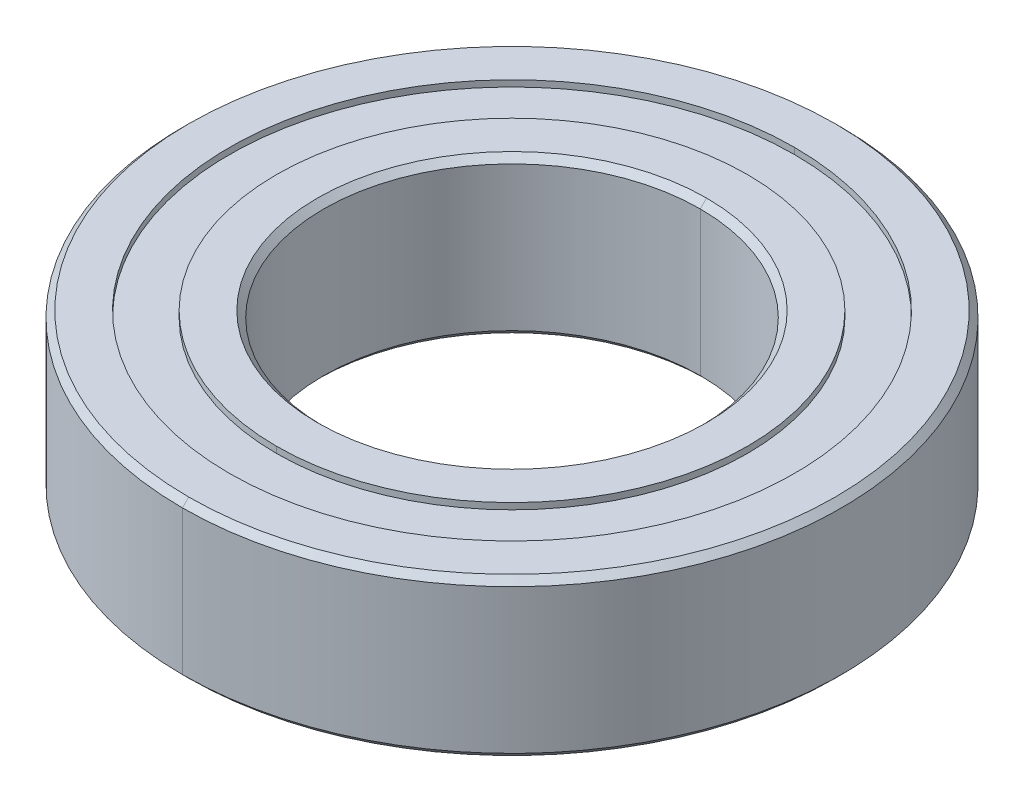
ISO-10303-21;
HEADER;
FILE_DESCRIPTION(('STEP AP214'),'2;1');
FILE_NAME('part.step','',(''),(''),'','','');
FILE_SCHEMA(('AUTOMOTIVE_DESIGN { 1 0 10303 214 1 1 1 1 }'));
ENDSEC;
DATA;
#1=APPLICATION_CONTEXT('core data for automotive mechanical design processes');
#2=APPLICATION_PROTOCOL_DEFINITION('international standard','automotive_design',2000,#1);
#3=PRODUCT_CONTEXT('',#1,'mechanical');
#4=PRODUCT('Part','Part','',(#3));
#5=PRODUCT_RELATED_PRODUCT_CATEGORY('part','',(#4));
#6=PRODUCT_DEFINITION_FORMATION('','',#4);
#7=PRODUCT_DEFINITION_CONTEXT('part definition',#1,'design');
#8=PRODUCT_DEFINITION('design','',#6,#7);
#9=PRODUCT_DEFINITION_SHAPE('','',#8);
#10=(LENGTH_UNIT() NAMED_UNIT(*) SI_UNIT(.MILLI.,.METRE.));
#11=(NAMED_UNIT(*) PLANE_ANGLE_UNIT() SI_UNIT($,.RADIAN.));
#12=(NAMED_UNIT(*) SI_UNIT($,.STERADIAN.) SOLID_ANGLE_UNIT());
#13=UNCERTAINTY_MEASURE_WITH_UNIT(LENGTH_MEASURE(1.E-05),#10,'distance_accuracy_value','');
#14=(GEOMETRIC_REPRESENTATION_CONTEXT(3) GLOBAL_UNCERTAINTY_ASSIGNED_CONTEXT((#13)) GLOBAL_UNIT_ASSIGNED_CONTEXT((#10,
#11,#12)) REPRESENTATION_CONTEXT('',''));
#15=CARTESIAN_POINT('',(0.,0.,0.));
#16=DIRECTION('',(0.,0.,1.));
#17=DIRECTION('',(1.,0.,0.));
#18=AXIS2_PLACEMENT_3D('',#15,#16,#17);
#19=CARTESIAN_POINT('',(0.,0.,0.));
#20=DIRECTION('',(0.,-1.,0.));
#21=DIRECTION('',(0.,0.,-1.));
#22=AXIS2_PLACEMENT_3D('',#19,#20,#21);
#23=CONICAL_SURFACE('',#22,6.2,0.785398163397443);
#24=DIRECTION('',(0.,-0.707106781186551,0.707106781186545));
#25=VECTOR('',#24,1.);
#26=CARTESIAN_POINT('',(0.,0.,6.2));
#27=LINE('',#26,#25);
#28=CARTESIAN_POINT('',(0.,0.199999999999996,6.));
#29=VERTEX_POINT('',#28);
#30=CARTESIAN_POINT('',(0.,0.,6.2));
#31=VERTEX_POINT('',#30);
#32=EDGE_CURVE('E283',#29,#31,#27,.T.);
#33=ORIENTED_EDGE('',*,*,#32,.F.);
#34=CARTESIAN_POINT('',(0.,0.199999999999996,0.));
#35=DIRECTION('',(0.,-1.,0.));
#36=DIRECTION('',(0.,0.,1.));
#37=AXIS2_PLACEMENT_3D('',#34,#35,#36);
#38=CIRCLE('',#37,6.);
#39=CARTESIAN_POINT('',(0.,0.199999999999996,-6.));
#40=VERTEX_POINT('',#39);
#41=EDGE_CURVE('E255',#40,#29,#38,.T.);
#42=ORIENTED_EDGE('',*,*,#41,.F.);
#43=DIRECTION('',(0.,-0.707106781186551,-0.707106781186545));
#44=VECTOR('',#43,1.);
#45=CARTESIAN_POINT('',(0.,0.,-6.2));
#46=LINE('',#45,#44);
#47=CARTESIAN_POINT('',(0.,0.,-6.2));
#48=VERTEX_POINT('',#47);
#49=EDGE_CURVE('E284',#40,#48,#46,.T.);
#50=ORIENTED_EDGE('',*,*,#49,.T.);
#51=CARTESIAN_POINT('',(0.,0.,0.));
#52=DIRECTION('',(0.,1.,0.));
#53=DIRECTION('',(0.,0.,1.));
#54=AXIS2_PLACEMENT_3D('',#51,#52,#53);
#55=CIRCLE('',#54,6.2);
#56=EDGE_CURVE('E181',#31,#48,#55,.T.);
#57=ORIENTED_EDGE('',*,*,#56,.F.);
#58=EDGE_LOOP('',(#33,#42,#50,#57));
#59=FACE_BOUND('',#58,.T.);
#60=ADVANCED_FACE('F18',(#59),#23,.F.);
#61=CARTESIAN_POINT('',(0.,4.8,0.));
#62=DIRECTION('',(0.,1.,0.));
#63=DIRECTION('',(0.,0.,1.));
#64=AXIS2_PLACEMENT_3D('',#61,#62,#63);
#65=CONICAL_SURFACE('',#64,6.,0.785398163397452);
#66=DIRECTION('',(0.,0.707106781186545,-0.707106781186551));
#67=VECTOR('',#66,1.);
#68=CARTESIAN_POINT('',(0.,4.8,-6.));
#69=LINE('',#68,#67);
#70=CARTESIAN_POINT('',(0.,4.8,-6.));
#71=VERTEX_POINT('',#70);
#72=CARTESIAN_POINT('',(0.,5.,-6.2));
#73=VERTEX_POINT('',#72);
#74=EDGE_CURVE('E295',#71,#73,#69,.T.);
#75=ORIENTED_EDGE('',*,*,#74,.F.);
#76=CARTESIAN_POINT('',(0.,4.8,0.));
#77=DIRECTION('',(0.,1.,0.));
#78=DIRECTION('',(0.,0.,1.));
#79=AXIS2_PLACEMENT_3D('',#76,#77,#78);
#80=CIRCLE('',#79,6.);
#81=CARTESIAN_POINT('',(0.,4.8,6.));
#82=VERTEX_POINT('',#81);
#83=EDGE_CURVE('E253',#82,#71,#80,.T.);
#84=ORIENTED_EDGE('',*,*,#83,.F.);
#85=DIRECTION('',(0.,0.707106781186545,0.707106781186551));
#86=VECTOR('',#85,1.);
#87=CARTESIAN_POINT('',(0.,4.8,6.));
#88=LINE('',#87,#86);
#89=CARTESIAN_POINT('',(0.,5.,6.2));
#90=VERTEX_POINT('',#89);
#91=EDGE_CURVE('E298',#82,#90,#88,.T.);
#92=ORIENTED_EDGE('',*,*,#91,.T.);
#93=CARTESIAN_POINT('',(0.,5.,0.));
#94=DIRECTION('',(0.,-1.,0.));
#95=DIRECTION('',(0.,0.,1.));
#96=AXIS2_PLACEMENT_3D('',#93,#94,#95);
#97=CIRCLE('',#96,6.2);
#98=EDGE_CURVE('E185',#73,#90,#97,.T.);
#99=ORIENTED_EDGE('',*,*,#98,.F.);
#100=EDGE_LOOP('',(#75,#84,#92,#99));
#101=FACE_BOUND('',#100,.T.);
#102=ADVANCED_FACE('F418',(#101),#65,.F.);
#103=CARTESIAN_POINT('',(0.,0.199999999999997,0.));
#104=DIRECTION('',(0.,1.,0.));
#105=DIRECTION('',(0.,0.,1.));
#106=AXIS2_PLACEMENT_3D('',#103,#104,#105);
#107=CONICAL_SURFACE('',#106,10.5,0.785398163397452);
#108=DIRECTION('',(0.,0.707106781186545,-0.707106781186551));
#109=VECTOR('',#108,1.);
#110=CARTESIAN_POINT('',(0.,0.199999999999997,-10.5));
#111=LINE('',#110,#109);
#112=CARTESIAN_POINT('',(0.,0.,-10.3));
#113=VERTEX_POINT('',#112);
#114=CARTESIAN_POINT('',(0.,0.199999999999997,-10.5));
#115=VERTEX_POINT('',#114);
#116=EDGE_CURVE('E285',#113,#115,#111,.T.);
#117=ORIENTED_EDGE('',*,*,#116,.F.);
#118=CARTESIAN_POINT('',(0.,0.,0.));
#119=DIRECTION('',(0.,-1.,0.));
#120=DIRECTION('',(0.,0.,1.));
#121=AXIS2_PLACEMENT_3D('',#118,#119,#120);
#122=CIRCLE('',#121,10.3);
#123=CARTESIAN_POINT('',(0.,0.,10.3));
#124=VERTEX_POINT('',#123);
#125=EDGE_CURVE('E237',#124,#113,#122,.T.);
#126=ORIENTED_EDGE('',*,*,#125,.F.);
#127=DIRECTION('',(0.,0.707106781186545,0.707106781186551));
#128=VECTOR('',#127,1.);
#129=CARTESIAN_POINT('',(0.,0.199999999999997,10.5));
#130=LINE('',#129,#128);
#131=CARTESIAN_POINT('',(0.,0.199999999999997,10.5));
#132=VERTEX_POINT('',#131);
#133=EDGE_CURVE('E310',#124,#132,#130,.T.);
#134=ORIENTED_EDGE('',*,*,#133,.T.);
#135=CARTESIAN_POINT('',(0.,0.199999999999997,0.));
#136=DIRECTION('',(0.,1.,0.));
#137=DIRECTION('',(0.,0.,1.));
#138=AXIS2_PLACEMENT_3D('',#135,#136,#137);
#139=CIRCLE('',#138,10.5);
#140=EDGE_CURVE('E249',#115,#132,#139,.T.);
#141=ORIENTED_EDGE('',*,*,#140,.F.);
#142=EDGE_LOOP('',(#117,#126,#134,#141));
#143=FACE_BOUND('',#142,.T.);
#144=ADVANCED_FACE('F385',(#143),#107,.T.);
#145=CARTESIAN_POINT('',(0.,5.,0.));
#146=DIRECTION('',(0.,-1.,0.));
#147=DIRECTION('',(0.,0.,-1.));
#148=AXIS2_PLACEMENT_3D('',#145,#146,#147);
#149=CONICAL_SURFACE('',#148,10.3,0.785398163397448);
#150=DIRECTION('',(0.,-0.707106781186548,0.707106781186548));
#151=VECTOR('',#150,1.);
#152=CARTESIAN_POINT('',(0.,5.,10.3));
#153=LINE('',#152,#151);
#154=CARTESIAN_POINT('',(0.,5.,10.3));
#155=VERTEX_POINT('',#154);
#156=CARTESIAN_POINT('',(0.,4.8,10.5));
#157=VERTEX_POINT('',#156);
#158=EDGE_CURVE('E321',#155,#157,#153,.T.);
#159=ORIENTED_EDGE('',*,*,#158,.F.);
#160=CARTESIAN_POINT('',(0.,5.,0.));
#161=DIRECTION('',(0.,1.,0.));
#162=DIRECTION('',(0.,0.,1.));
#163=AXIS2_PLACEMENT_3D('',#160,#161,#162);
#164=CIRCLE('',#163,10.3);
#165=CARTESIAN_POINT('',(0.,5.,-10.3));
#166=VERTEX_POINT('',#165);
#167=EDGE_CURVE('E231',#166,#155,#164,.T.);
#168=ORIENTED_EDGE('',*,*,#167,.F.);
#169=DIRECTION('',(0.,-0.707106781186548,-0.707106781186548));
#170=VECTOR('',#169,1.);
#171=CARTESIAN_POINT('',(0.,5.,-10.3));
#172=LINE('',#171,#170);
#173=CARTESIAN_POINT('',(0.,4.8,-10.5));
#174=VERTEX_POINT('',#173);
#175=EDGE_CURVE('E329',#166,#174,#172,.T.);
#176=ORIENTED_EDGE('',*,*,#175,.T.);
#177=CARTESIAN_POINT('',(0.,4.8,0.));
#178=DIRECTION('',(0.,-1.,0.));
#179=DIRECTION('',(0.,0.,1.));
#180=AXIS2_PLACEMENT_3D('',#177,#178,#179);
#181=CIRCLE('',#180,10.5);
#182=EDGE_CURVE('E244',#157,#174,#181,.T.);
#183=ORIENTED_EDGE('',*,*,#182,.F.);
#184=EDGE_LOOP('',(#159,#168,#176,#183));
#185=FACE_BOUND('',#184,.T.);
#186=ADVANCED_FACE('F395',(#185),#149,.T.);
#187=CARTESIAN_POINT('',(0.,0.2,0.));
#188=DIRECTION('',(0.,-1.,0.));
#189=DIRECTION('',(0.,0.,-1.));
#190=AXIS2_PLACEMENT_3D('',#187,#188,#189);
#191=CYLINDRICAL_SURFACE('',#190,7.5);
#192=DIRECTION('',(0.,-1.,0.));
#193=VECTOR('',#192,1.);
#194=CARTESIAN_POINT('',(0.,0.2,7.5));
#195=LINE('',#194,#193);
#196=CARTESIAN_POINT('',(0.,0.2,7.5));
#197=VERTEX_POINT('',#196);
#198=CARTESIAN_POINT('',(0.,0.,7.5));
#199=VERTEX_POINT('',#198);
#200=EDGE_CURVE('E336',#197,#199,#195,.T.);
#201=ORIENTED_EDGE('',*,*,#200,.F.);
#202=CARTESIAN_POINT('',(0.,0.2,0.));
#203=DIRECTION('',(0.,-1.,0.));
#204=DIRECTION('',(0.,0.,-1.));
#205=AXIS2_PLACEMENT_3D('',#202,#203,#204);
#206=CIRCLE('',#205,7.5);
#207=CARTESIAN_POINT('',(0.,0.2,-7.5));
#208=VERTEX_POINT('',#207);
#209=EDGE_CURVE('E11',#197,#208,#206,.T.);
#210=ORIENTED_EDGE('',*,*,#209,.T.);
#211=DIRECTION('',(0.,-1.,0.));
#212=VECTOR('',#211,1.);
#213=CARTESIAN_POINT('',(0.,0.2,-7.5));
#214=LINE('',#213,#212);
#215=CARTESIAN_POINT('',(0.,0.,-7.5));
#216=VERTEX_POINT('',#215);
#217=EDGE_CURVE('E343',#208,#216,#214,.T.);
#218=ORIENTED_EDGE('',*,*,#217,.T.);
#219=CARTESIAN_POINT('',(0.,0.,0.));
#220=DIRECTION('',(0.,-1.,0.));
#221=DIRECTION('',(0.,0.,-1.));
#222=AXIS2_PLACEMENT_3D('',#219,#220,#221);
#223=CIRCLE('',#222,7.5);
#224=EDGE_CURVE('E227',#199,#216,#223,.T.);
#225=ORIENTED_EDGE('',*,*,#224,.F.);
#226=EDGE_LOOP('',(#201,#210,#218,#225));
#227=FACE_BOUND('',#226,.T.);
#228=ADVANCED_FACE('F490',(#227),#191,.T.);
#229=CARTESIAN_POINT('',(0.,0.2,0.));
#230=DIRECTION('',(0.,-1.,0.));
#231=DIRECTION('',(0.,0.,-1.));
#232=AXIS2_PLACEMENT_3D('',#229,#230,#231);
#233=PLANE('',#232);
#234=CARTESIAN_POINT('',(0.,0.2,0.));
#235=DIRECTION('',(0.,-1.,0.));
#236=DIRECTION('',(0.,0.,-1.));
#237=AXIS2_PLACEMENT_3D('',#234,#235,#236);
#238=CIRCLE('',#237,7.5);
#239=EDGE_CURVE('E335',#208,#197,#238,.T.);
#240=ORIENTED_EDGE('',*,*,#239,.F.);
#241=ORIENTED_EDGE('',*,*,#209,.F.);
#242=EDGE_LOOP('',(#240,#241));
#243=FACE_BOUND('',#242,.T.);
#244=CARTESIAN_POINT('',(0.,0.2,0.));
#245=DIRECTION('',(0.,-1.,0.));
#246=DIRECTION('',(0.,0.,-1.));
#247=AXIS2_PLACEMENT_3D('',#244,#245,#246);
#248=CIRCLE('',#247,9.);
#249=CARTESIAN_POINT('',(0.,0.2,-9.));
#250=VERTEX_POINT('',#249);
#251=CARTESIAN_POINT('',(0.,0.2,9.));
#252=VERTEX_POINT('',#251);
#253=EDGE_CURVE('E21',#250,#252,#248,.T.);
#254=ORIENTED_EDGE('',*,*,#253,.T.);
#255=CARTESIAN_POINT('',(0.,0.2,0.));
#256=DIRECTION('',(0.,-1.,0.));
#257=DIRECTION('',(0.,0.,-1.));
#258=AXIS2_PLACEMENT_3D('',#255,#256,#257);
#259=CIRCLE('',#258,9.);
#260=EDGE_CURVE('E348',#252,#250,#259,.T.);
#261=ORIENTED_EDGE('',*,*,#260,.T.);
#262=EDGE_LOOP('',(#254,#261));
#263=FACE_BOUND('',#262,.T.);
#264=ADVANCED_FACE('F482',(#243,#263),#233,.T.);
#265=CARTESIAN_POINT('',(0.,0.2,0.));
#266=DIRECTION('',(0.,-1.,0.));
#267=DIRECTION('',(0.,0.,-1.));
#268=AXIS2_PLACEMENT_3D('',#265,#266,#267);
#269=CYLINDRICAL_SURFACE('',#268,9.);
#270=DIRECTION('',(0.,-1.,0.));
#271=VECTOR('',#270,1.);
#272=CARTESIAN_POINT('',(0.,0.2,9.));
#273=LINE('',#272,#271);
#274=CARTESIAN_POINT('',(0.,0.,9.));
#275=VERTEX_POINT('',#274);
#276=EDGE_CURVE('E355',#252,#275,#273,.T.);
#277=ORIENTED_EDGE('',*,*,#276,.F.);
#278=ORIENTED_EDGE('',*,*,#253,.F.);
#279=DIRECTION('',(0.,-1.,0.));
#280=VECTOR('',#279,1.);
#281=CARTESIAN_POINT('',(0.,0.2,-9.));
#282=LINE('',#281,#280);
#283=CARTESIAN_POINT('',(0.,0.,-9.));
#284=VERTEX_POINT('',#283);
#285=EDGE_CURVE('E197',#250,#284,#282,.T.);
#286=ORIENTED_EDGE('',*,*,#285,.T.);
#287=CARTESIAN_POINT('',(0.,0.,0.));
#288=DIRECTION('',(0.,-1.,0.));
#289=DIRECTION('',(0.,0.,-1.));
#290=AXIS2_PLACEMENT_3D('',#287,#288,#289);
#291=CIRCLE('',#290,9.);
#292=EDGE_CURVE('E245',#284,#275,#291,.T.);
#293=ORIENTED_EDGE('',*,*,#292,.T.);
#294=EDGE_LOOP('',(#277,#278,#286,#293));
#295=FACE_BOUND('',#294,.T.);
#296=ADVANCED_FACE('F368',(#295),#269,.F.);
#297=CARTESIAN_POINT('',(0.,4.8,0.));
#298=DIRECTION('',(0.,1.,0.));
#299=DIRECTION('',(0.,0.,1.));
#300=AXIS2_PLACEMENT_3D('',#297,#298,#299);
#301=CYLINDRICAL_SURFACE('',#300,7.5);
#302=DIRECTION('',(0.,1.,0.));
#303=VECTOR('',#302,1.);
#304=CARTESIAN_POINT('',(0.,4.8,-7.5));
#305=LINE('',#304,#303);
#306=CARTESIAN_POINT('',(0.,4.8,-7.5));
#307=VERTEX_POINT('',#306);
#308=CARTESIAN_POINT('',(0.,5.,-7.5));
#309=VERTEX_POINT('',#308);
#310=EDGE_CURVE('E173',#307,#309,#305,.T.);
#311=ORIENTED_EDGE('',*,*,#310,.F.);
#312=CARTESIAN_POINT('',(0.,4.8,0.));
#313=DIRECTION('',(0.,1.,0.));
#314=DIRECTION('',(0.,0.,1.));
#315=AXIS2_PLACEMENT_3D('',#312,#313,#314);
#316=CIRCLE('',#315,7.5);
#317=CARTESIAN_POINT('',(0.,4.8,7.5));
#318=VERTEX_POINT('',#317);
#319=EDGE_CURVE('E232',#307,#318,#316,.T.);
#320=ORIENTED_EDGE('',*,*,#319,.T.);
#321=DIRECTION('',(0.,1.,0.));
#322=VECTOR('',#321,1.);
#323=CARTESIAN_POINT('',(0.,4.8,7.5));
#324=LINE('',#323,#322);
#325=CARTESIAN_POINT('',(0.,5.,7.5));
#326=VERTEX_POINT('',#325);
#327=EDGE_CURVE('E176',#318,#326,#324,.T.);
#328=ORIENTED_EDGE('',*,*,#327,.T.);
#329=CARTESIAN_POINT('',(0.,5.,0.));
#330=DIRECTION('',(0.,1.,0.));
#331=DIRECTION('',(0.,0.,1.));
#332=AXIS2_PLACEMENT_3D('',#329,#330,#331);
#333=CIRCLE('',#332,7.5);
#334=EDGE_CURVE('E168',#309,#326,#333,.T.);
#335=ORIENTED_EDGE('',*,*,#334,.F.);
#336=EDGE_LOOP('',(#311,#320,#328,#335));
#337=FACE_BOUND('',#336,.T.);
#338=ADVANCED_FACE('F172',(#337),#301,.T.);
#339=CARTESIAN_POINT('',(0.,4.8,0.));
#340=DIRECTION('',(0.,1.,0.));
#341=DIRECTION('',(1.,0.,0.));
#342=AXIS2_PLACEMENT_3D('',#339,#340,#341);
#343=PLANE('',#342);
#344=CARTESIAN_POINT('',(0.,4.8,0.));
#345=DIRECTION('',(0.,1.,0.));
#346=DIRECTION('',(0.,0.,1.));
#347=AXIS2_PLACEMENT_3D('',#344,#345,#346);
#348=CIRCLE('',#347,7.5);
#349=EDGE_CURVE('E192',#318,#307,#348,.T.);
#350=ORIENTED_EDGE('',*,*,#349,.F.);
#351=ORIENTED_EDGE('',*,*,#319,.F.);
#352=EDGE_LOOP('',(#350,#351));
#353=FACE_BOUND('',#352,.T.);
#354=CARTESIAN_POINT('',(0.,4.8,0.));
#355=DIRECTION('',(0.,1.,0.));
#356=DIRECTION('',(0.,0.,1.));
#357=AXIS2_PLACEMENT_3D('',#354,#355,#356);
#358=CIRCLE('',#357,9.);
#359=CARTESIAN_POINT('',(0.,4.8,9.));
#360=VERTEX_POINT('',#359);
#361=CARTESIAN_POINT('',(0.,4.8,-9.));
#362=VERTEX_POINT('',#361);
#363=EDGE_CURVE('E238',#360,#362,#358,.T.);
#364=ORIENTED_EDGE('',*,*,#363,.T.);
#365=CARTESIAN_POINT('',(0.,4.8,0.));
#366=DIRECTION('',(0.,1.,0.));
#367=DIRECTION('',(0.,0.,1.));
#368=AXIS2_PLACEMENT_3D('',#365,#366,#367);
#369=CIRCLE('',#368,9.);
#370=EDGE_CURVE('E203',#362,#360,#369,.T.);
#371=ORIENTED_EDGE('',*,*,#370,.T.);
#372=EDGE_LOOP('',(#364,#371));
#373=FACE_BOUND('',#372,.T.);
#374=ADVANCED_FACE('F261',(#353,#373),#343,.T.);
#375=CARTESIAN_POINT('',(0.,4.8,0.));
#376=DIRECTION('',(0.,1.,0.));
#377=DIRECTION('',(0.,0.,1.));
#378=AXIS2_PLACEMENT_3D('',#375,#376,#377);
#379=CYLINDRICAL_SURFACE('',#378,9.);
#380=DIRECTION('',(0.,1.,0.));
#381=VECTOR('',#380,1.);
#382=CARTESIAN_POINT('',(0.,4.8,-9.));
#383=LINE('',#382,#381);
#384=CARTESIAN_POINT('',(0.,5.,-9.));
#385=VERTEX_POINT('',#384);
#386=EDGE_CURVE('E202',#362,#385,#383,.T.);
#387=ORIENTED_EDGE('',*,*,#386,.F.);
#388=ORIENTED_EDGE('',*,*,#363,.F.);
#389=DIRECTION('',(0.,1.,0.));
#390=VECTOR('',#389,1.);
#391=CARTESIAN_POINT('',(0.,4.8,9.));
#392=LINE('',#391,#390);
#393=CARTESIAN_POINT('',(0.,5.,9.));
#394=VERTEX_POINT('',#393);
#395=EDGE_CURVE('E218',#360,#394,#392,.T.);
#396=ORIENTED_EDGE('',*,*,#395,.T.);
#397=CARTESIAN_POINT('',(0.,5.,0.));
#398=DIRECTION('',(0.,1.,0.));
#399=DIRECTION('',(0.,0.,1.));
#400=AXIS2_PLACEMENT_3D('',#397,#398,#399);
#401=CIRCLE('',#400,9.);
#402=EDGE_CURVE('E39',#394,#385,#401,.T.);
#403=ORIENTED_EDGE('',*,*,#402,.T.);
#404=EDGE_LOOP('',(#387,#388,#396,#403));
#405=FACE_BOUND('',#404,.T.);
#406=ADVANCED_FACE('F262',(#405),#379,.F.);
#407=CARTESIAN_POINT('',(0.,5.,0.));
#408=DIRECTION('',(0.,-1.,0.));
#409=DIRECTION('',(0.,0.,-1.));
#410=AXIS2_PLACEMENT_3D('',#407,#408,#409);
#411=CYLINDRICAL_SURFACE('',#410,6.);
#412=DIRECTION('',(0.,-1.,0.));
#413=VECTOR('',#412,1.);
#414=CARTESIAN_POINT('',(0.,5.,6.));
#415=LINE('',#414,#413);
#416=EDGE_CURVE('E224',#82,#29,#415,.T.);
#417=ORIENTED_EDGE('',*,*,#416,.F.);
#418=ORIENTED_EDGE('',*,*,#83,.T.);
#419=DIRECTION('',(0.,-1.,0.));
#420=VECTOR('',#419,1.);
#421=CARTESIAN_POINT('',(0.,5.,-6.));
#422=LINE('',#421,#420);
#423=EDGE_CURVE('E214',#71,#40,#422,.T.);
#424=ORIENTED_EDGE('',*,*,#423,.T.);
#425=ORIENTED_EDGE('',*,*,#41,.T.);
#426=EDGE_LOOP('',(#417,#418,#424,#425));
#427=FACE_BOUND('',#426,.T.);
#428=ADVANCED_FACE('F460',(#427),#411,.F.);
#429=CARTESIAN_POINT('',(0.,5.,0.));
#430=DIRECTION('',(0.,-1.,0.));
#431=DIRECTION('',(0.,0.,-1.));
#432=AXIS2_PLACEMENT_3D('',#429,#430,#431);
#433=CYLINDRICAL_SURFACE('',#432,10.5);
#434=DIRECTION('',(0.,-1.,0.));
#435=VECTOR('',#434,1.);
#436=CARTESIAN_POINT('',(0.,5.,10.5));
#437=LINE('',#436,#435);
#438=EDGE_CURVE('E209',#157,#132,#437,.T.);
#439=ORIENTED_EDGE('',*,*,#438,.F.);
#440=ORIENTED_EDGE('',*,*,#182,.T.);
#441=DIRECTION('',(0.,-1.,0.));
#442=VECTOR('',#441,1.);
#443=CARTESIAN_POINT('',(0.,5.,-10.5));
#444=LINE('',#443,#442);
#445=EDGE_CURVE('E212',#174,#115,#444,.T.);
#446=ORIENTED_EDGE('',*,*,#445,.T.);
#447=ORIENTED_EDGE('',*,*,#140,.T.);
#448=EDGE_LOOP('',(#439,#440,#446,#447));
#449=FACE_BOUND('',#448,.T.);
#450=ADVANCED_FACE('F376',(#449),#433,.T.);
#451=CARTESIAN_POINT('',(0.,0.,0.));
#452=DIRECTION('',(0.,1.,0.));
#453=DIRECTION('',(1.,0.,0.));
#454=AXIS2_PLACEMENT_3D('',#451,#452,#453);
#455=PLANE('',#454);
#456=ORIENTED_EDGE('',*,*,#292,.F.);
#457=CARTESIAN_POINT('',(0.,0.,0.));
#458=DIRECTION('',(0.,-1.,0.));
#459=DIRECTION('',(0.,0.,-1.));
#460=AXIS2_PLACEMENT_3D('',#457,#458,#459);
#461=CIRCLE('',#460,9.);
#462=EDGE_CURVE('E357',#275,#284,#461,.T.);
#463=ORIENTED_EDGE('',*,*,#462,.F.);
#464=EDGE_LOOP('',(#456,#463));
#465=FACE_BOUND('',#464,.T.);
#466=ORIENTED_EDGE('',*,*,#125,.T.);
#467=CARTESIAN_POINT('',(0.,0.,0.));
#468=DIRECTION('',(0.,-1.,0.));
#469=DIRECTION('',(0.,0.,1.));
#470=AXIS2_PLACEMENT_3D('',#467,#468,#469);
#471=CIRCLE('',#470,10.3);
#472=EDGE_CURVE('E287',#113,#124,#471,.T.);
#473=ORIENTED_EDGE('',*,*,#472,.T.);
#474=EDGE_LOOP('',(#466,#473));
#475=FACE_BOUND('',#474,.T.);
#476=ADVANCED_FACE('F375',(#465,#475),#455,.F.);
#477=CARTESIAN_POINT('',(0.,5.,0.));
#478=DIRECTION('',(0.,1.,0.));
#479=DIRECTION('',(1.,0.,0.));
#480=AXIS2_PLACEMENT_3D('',#477,#478,#479);
#481=PLANE('',#480);
#482=ORIENTED_EDGE('',*,*,#402,.F.);
#483=CARTESIAN_POINT('',(0.,5.,0.));
#484=DIRECTION('',(0.,1.,0.));
#485=DIRECTION('',(0.,0.,1.));
#486=AXIS2_PLACEMENT_3D('',#483,#484,#485);
#487=CIRCLE('',#486,9.);
#488=EDGE_CURVE('E207',#385,#394,#487,.T.);
#489=ORIENTED_EDGE('',*,*,#488,.F.);
#490=EDGE_LOOP('',(#482,#489));
#491=FACE_BOUND('',#490,.T.);
#492=ORIENTED_EDGE('',*,*,#167,.T.);
#493=CARTESIAN_POINT('',(0.,5.,0.));
#494=DIRECTION('',(0.,1.,0.));
#495=DIRECTION('',(0.,0.,1.));
#496=AXIS2_PLACEMENT_3D('',#493,#494,#495);
#497=CIRCLE('',#496,10.3);
#498=EDGE_CURVE('E320',#155,#166,#497,.T.);
#499=ORIENTED_EDGE('',*,*,#498,.T.);
#500=EDGE_LOOP('',(#492,#499));
#501=FACE_BOUND('',#500,.T.);
#502=ADVANCED_FACE('F374',(#491,#501),#481,.T.);
#503=CARTESIAN_POINT('',(0.,5.,0.));
#504=DIRECTION('',(0.,1.,0.));
#505=DIRECTION('',(1.,0.,0.));
#506=AXIS2_PLACEMENT_3D('',#503,#504,#505);
#507=PLANE('',#506);
#508=CARTESIAN_POINT('',(0.,5.,0.));
#509=DIRECTION('',(0.,-1.,0.));
#510=DIRECTION('',(0.,0.,1.));
#511=AXIS2_PLACEMENT_3D('',#508,#509,#510);
#512=CIRCLE('',#511,6.2);
#513=EDGE_CURVE('E294',#90,#73,#512,.T.);
#514=ORIENTED_EDGE('',*,*,#513,.T.);
#515=ORIENTED_EDGE('',*,*,#98,.T.);
#516=EDGE_LOOP('',(#514,#515));
#517=FACE_BOUND('',#516,.T.);
#518=CARTESIAN_POINT('',(0.,5.,0.));
#519=DIRECTION('',(0.,1.,0.));
#520=DIRECTION('',(0.,0.,1.));
#521=AXIS2_PLACEMENT_3D('',#518,#519,#520);
#522=CIRCLE('',#521,7.5);
#523=EDGE_CURVE('E182',#326,#309,#522,.T.);
#524=ORIENTED_EDGE('',*,*,#523,.T.);
#525=ORIENTED_EDGE('',*,*,#334,.T.);
#526=EDGE_LOOP('',(#524,#525));
#527=FACE_BOUND('',#526,.T.);
#528=ADVANCED_FACE('F184',(#517,#527),#507,.T.);
#529=CARTESIAN_POINT('',(0.,0.,0.));
#530=DIRECTION('',(0.,1.,0.));
#531=DIRECTION('',(1.,0.,0.));
#532=AXIS2_PLACEMENT_3D('',#529,#530,#531);
#533=PLANE('',#532);
#534=CARTESIAN_POINT('',(0.,0.,0.));
#535=DIRECTION('',(0.,1.,0.));
#536=DIRECTION('',(0.,0.,1.));
#537=AXIS2_PLACEMENT_3D('',#534,#535,#536);
#538=CIRCLE('',#537,6.2);
#539=EDGE_CURVE('E278',#48,#31,#538,.T.);
#540=ORIENTED_EDGE('',*,*,#539,.T.);
#541=ORIENTED_EDGE('',*,*,#56,.T.);
#542=EDGE_LOOP('',(#540,#541));
#543=FACE_BOUND('',#542,.T.);
#544=CARTESIAN_POINT('',(0.,0.,0.));
#545=DIRECTION('',(0.,-1.,0.));
#546=DIRECTION('',(0.,0.,-1.));
#547=AXIS2_PLACEMENT_3D('',#544,#545,#546);
#548=CIRCLE('',#547,7.5);
#549=EDGE_CURVE('E340',#216,#199,#548,.T.);
#550=ORIENTED_EDGE('',*,*,#549,.T.);
#551=ORIENTED_EDGE('',*,*,#224,.T.);
#552=EDGE_LOOP('',(#550,#551));
#553=FACE_BOUND('',#552,.T.);
#554=ADVANCED_FACE('F409',(#543,#553),#533,.F.);
#555=CARTESIAN_POINT('',(0.,5.,0.));
#556=DIRECTION('',(0.,-1.,0.));
#557=DIRECTION('',(0.,0.,-1.));
#558=AXIS2_PLACEMENT_3D('',#555,#556,#557);
#559=CYLINDRICAL_SURFACE('',#558,10.5);
#560=CARTESIAN_POINT('',(0.,4.8,0.));
#561=DIRECTION('',(0.,-1.,0.));
#562=DIRECTION('',(0.,0.,1.));
#563=AXIS2_PLACEMENT_3D('',#560,#561,#562);
#564=CIRCLE('',#563,10.5);
#565=EDGE_CURVE('E324',#174,#157,#564,.T.);
#566=ORIENTED_EDGE('',*,*,#565,.T.);
#567=ORIENTED_EDGE('',*,*,#438,.T.);
#568=CARTESIAN_POINT('',(0.,0.199999999999997,0.));
#569=DIRECTION('',(0.,1.,0.));
#570=DIRECTION('',(0.,0.,1.));
#571=AXIS2_PLACEMENT_3D('',#568,#569,#570);
#572=CIRCLE('',#571,10.5);
#573=EDGE_CURVE('E288',#132,#115,#572,.T.);
#574=ORIENTED_EDGE('',*,*,#573,.T.);
#575=ORIENTED_EDGE('',*,*,#445,.F.);
#576=EDGE_LOOP('',(#566,#567,#574,#575));
#577=FACE_BOUND('',#576,.T.);
#578=ADVANCED_FACE('F389',(#577),#559,.T.);
#579=CARTESIAN_POINT('',(0.,5.,0.));
#580=DIRECTION('',(0.,-1.,0.));
#581=DIRECTION('',(0.,0.,-1.));
#582=AXIS2_PLACEMENT_3D('',#579,#580,#581);
#583=CYLINDRICAL_SURFACE('',#582,6.);
#584=CARTESIAN_POINT('',(0.,4.8,0.));
#585=DIRECTION('',(0.,1.,0.));
#586=DIRECTION('',(0.,0.,1.));
#587=AXIS2_PLACEMENT_3D('',#584,#585,#586);
#588=CIRCLE('',#587,6.);
#589=EDGE_CURVE('E279',#71,#82,#588,.T.);
#590=ORIENTED_EDGE('',*,*,#589,.T.);
#591=ORIENTED_EDGE('',*,*,#416,.T.);
#592=CARTESIAN_POINT('',(0.,0.199999999999996,0.));
#593=DIRECTION('',(0.,-1.,0.));
#594=DIRECTION('',(0.,0.,1.));
#595=AXIS2_PLACEMENT_3D('',#592,#593,#594);
#596=CIRCLE('',#595,6.);
#597=EDGE_CURVE('E429',#29,#40,#596,.T.);
#598=ORIENTED_EDGE('',*,*,#597,.T.);
#599=ORIENTED_EDGE('',*,*,#423,.F.);
#600=EDGE_LOOP('',(#590,#591,#598,#599));
#601=FACE_BOUND('',#600,.T.);
#602=ADVANCED_FACE('F449',(#601),#583,.F.);
#603=CARTESIAN_POINT('',(0.,4.8,0.));
#604=DIRECTION('',(0.,1.,0.));
#605=DIRECTION('',(0.,0.,1.));
#606=AXIS2_PLACEMENT_3D('',#603,#604,#605);
#607=CYLINDRICAL_SURFACE('',#606,9.);
#608=ORIENTED_EDGE('',*,*,#370,.F.);
#609=ORIENTED_EDGE('',*,*,#386,.T.);
#610=ORIENTED_EDGE('',*,*,#488,.T.);
#611=ORIENTED_EDGE('',*,*,#395,.F.);
#612=EDGE_LOOP('',(#608,#609,#610,#611));
#613=FACE_BOUND('',#612,.T.);
#614=ADVANCED_FACE('F266',(#613),#607,.F.);
#615=CARTESIAN_POINT('',(0.,4.8,0.));
#616=DIRECTION('',(0.,1.,0.));
#617=DIRECTION('',(0.,0.,1.));
#618=AXIS2_PLACEMENT_3D('',#615,#616,#617);
#619=CYLINDRICAL_SURFACE('',#618,7.5);
#620=ORIENTED_EDGE('',*,*,#349,.T.);
#621=ORIENTED_EDGE('',*,*,#310,.T.);
#622=ORIENTED_EDGE('',*,*,#523,.F.);
#623=ORIENTED_EDGE('',*,*,#327,.F.);
#624=EDGE_LOOP('',(#620,#621,#622,#623));
#625=FACE_BOUND('',#624,.T.);
#626=ADVANCED_FACE('F188',(#625),#619,.T.);
#627=CARTESIAN_POINT('',(0.,0.2,0.));
#628=DIRECTION('',(0.,-1.,0.));
#629=DIRECTION('',(0.,0.,-1.));
#630=AXIS2_PLACEMENT_3D('',#627,#628,#629);
#631=CYLINDRICAL_SURFACE('',#630,9.);
#632=ORIENTED_EDGE('',*,*,#260,.F.);
#633=ORIENTED_EDGE('',*,*,#276,.T.);
#634=ORIENTED_EDGE('',*,*,#462,.T.);
#635=ORIENTED_EDGE('',*,*,#285,.F.);
#636=EDGE_LOOP('',(#632,#633,#634,#635));
#637=FACE_BOUND('',#636,.T.);
#638=ADVANCED_FACE('F367',(#637),#631,.F.);
#639=CARTESIAN_POINT('',(0.,0.2,0.));
#640=DIRECTION('',(0.,-1.,0.));
#641=DIRECTION('',(0.,0.,-1.));
#642=AXIS2_PLACEMENT_3D('',#639,#640,#641);
#643=CYLINDRICAL_SURFACE('',#642,7.5);
#644=ORIENTED_EDGE('',*,*,#239,.T.);
#645=ORIENTED_EDGE('',*,*,#200,.T.);
#646=ORIENTED_EDGE('',*,*,#549,.F.);
#647=ORIENTED_EDGE('',*,*,#217,.F.);
#648=EDGE_LOOP('',(#644,#645,#646,#647));
#649=FACE_BOUND('',#648,.T.);
#650=ADVANCED_FACE('F470',(#649),#643,.T.);
#651=CARTESIAN_POINT('',(0.,5.,0.));
#652=DIRECTION('',(0.,-1.,0.));
#653=DIRECTION('',(0.,0.,-1.));
#654=AXIS2_PLACEMENT_3D('',#651,#652,#653);
#655=CONICAL_SURFACE('',#654,10.3,0.785398163397448);
#656=ORIENTED_EDGE('',*,*,#498,.F.);
#657=ORIENTED_EDGE('',*,*,#158,.T.);
#658=ORIENTED_EDGE('',*,*,#565,.F.);
#659=ORIENTED_EDGE('',*,*,#175,.F.);
#660=EDGE_LOOP('',(#656,#657,#658,#659));
#661=FACE_BOUND('',#660,.T.);
#662=ADVANCED_FACE('F405',(#661),#655,.T.);
#663=CARTESIAN_POINT('',(0.,0.199999999999997,0.));
#664=DIRECTION('',(0.,1.,0.));
#665=DIRECTION('',(0.,0.,1.));
#666=AXIS2_PLACEMENT_3D('',#663,#664,#665);
#667=CONICAL_SURFACE('',#666,10.5,0.785398163397452);
#668=ORIENTED_EDGE('',*,*,#472,.F.);
#669=ORIENTED_EDGE('',*,*,#116,.T.);
#670=ORIENTED_EDGE('',*,*,#573,.F.);
#671=ORIENTED_EDGE('',*,*,#133,.F.);
#672=EDGE_LOOP('',(#668,#669,#670,#671));
#673=FACE_BOUND('',#672,.T.);
#674=ADVANCED_FACE('F384',(#673),#667,.T.);
#675=CARTESIAN_POINT('',(0.,4.8,0.));
#676=DIRECTION('',(0.,1.,0.));
#677=DIRECTION('',(0.,0.,1.));
#678=AXIS2_PLACEMENT_3D('',#675,#676,#677);
#679=CONICAL_SURFACE('',#678,6.,0.785398163397452);
#680=ORIENTED_EDGE('',*,*,#589,.F.);
#681=ORIENTED_EDGE('',*,*,#74,.T.);
#682=ORIENTED_EDGE('',*,*,#513,.F.);
#683=ORIENTED_EDGE('',*,*,#91,.F.);
#684=EDGE_LOOP('',(#680,#681,#682,#683));
#685=FACE_BOUND('',#684,.T.);
#686=ADVANCED_FACE('F455',(#685),#679,.F.);
#687=CARTESIAN_POINT('',(0.,0.,0.));
#688=DIRECTION('',(0.,-1.,0.));
#689=DIRECTION('',(0.,0.,-1.));
#690=AXIS2_PLACEMENT_3D('',#687,#688,#689);
#691=CONICAL_SURFACE('',#690,6.2,0.785398163397443);
#692=ORIENTED_EDGE('',*,*,#597,.F.);
#693=ORIENTED_EDGE('',*,*,#32,.T.);
#694=ORIENTED_EDGE('',*,*,#539,.F.);
#695=ORIENTED_EDGE('',*,*,#49,.F.);
#696=EDGE_LOOP('',(#692,#693,#694,#695));
#697=FACE_BOUND('',#696,.T.);
#698=ADVANCED_FACE('F433',(#697),#691,.F.);
#699=CLOSED_SHELL('',(#60,#102,#144,#186,#228,#264,#296,#338,#374,#406,#428,#450,#476,#502,#528,
#554,#578,#602,#614,#626,#638,#650,#662,#674,#686,#698));
#700=MANIFOLD_SOLID_BREP('B1',#699);
#701=ADVANCED_BREP_SHAPE_REPRESENTATION('',(#18,#700),#14);
#702=SHAPE_DEFINITION_REPRESENTATION(#9,#701);
ENDSEC;
END-ISO-10303-21;
